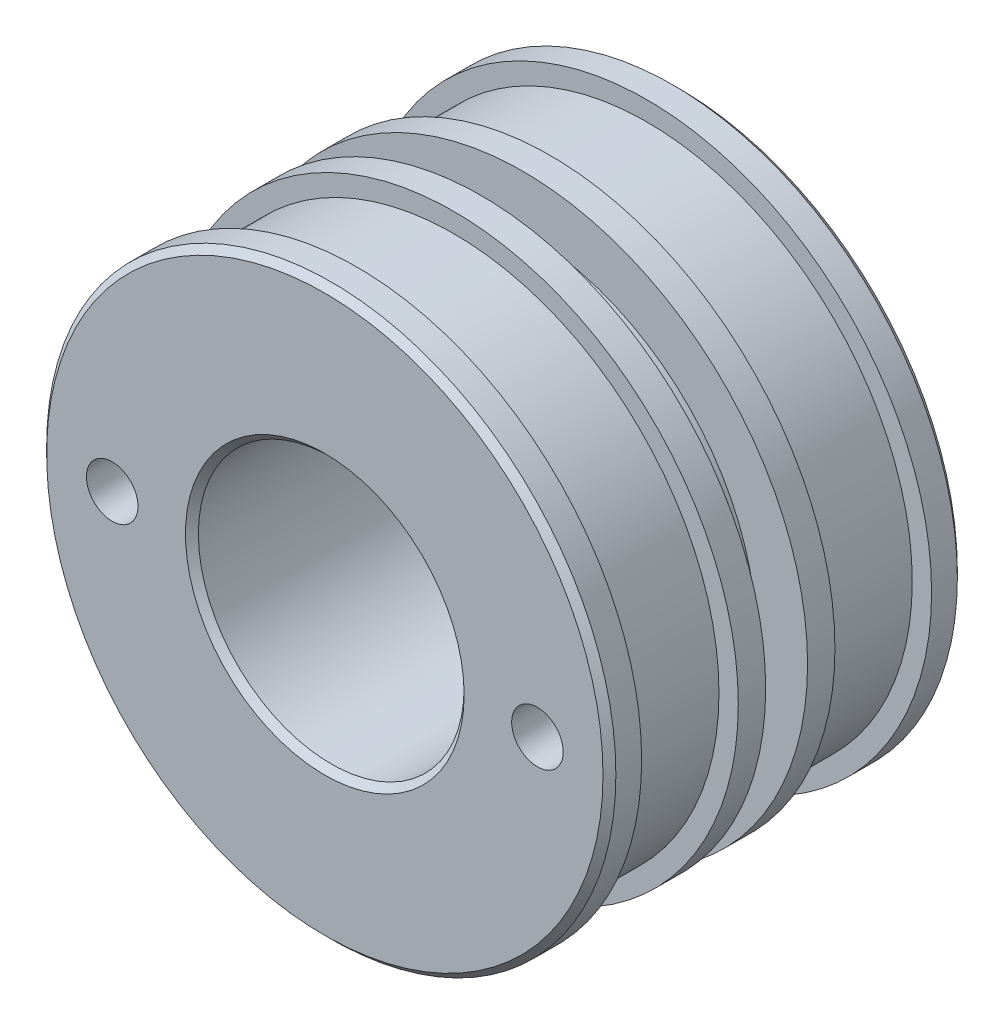
ISO-10303-21;
HEADER;
FILE_DESCRIPTION(('STEP AP214'),'2;1');
FILE_NAME('part.step','',(''),(''),'','','');
FILE_SCHEMA(('AUTOMOTIVE_DESIGN { 1 0 10303 214 1 1 1 1 }'));
ENDSEC;
DATA;
#1=APPLICATION_CONTEXT('core data for automotive mechanical design processes');
#2=APPLICATION_PROTOCOL_DEFINITION('international standard','automotive_design',2000,#1);
#3=PRODUCT_CONTEXT('',#1,'mechanical');
#4=PRODUCT('Part','Part','',(#3));
#5=PRODUCT_RELATED_PRODUCT_CATEGORY('part','',(#4));
#6=PRODUCT_DEFINITION_FORMATION('','',#4);
#7=PRODUCT_DEFINITION_CONTEXT('part definition',#1,'design');
#8=PRODUCT_DEFINITION('design','',#6,#7);
#9=PRODUCT_DEFINITION_SHAPE('','',#8);
#10=(LENGTH_UNIT() NAMED_UNIT(*) SI_UNIT(.MILLI.,.METRE.));
#11=(NAMED_UNIT(*) PLANE_ANGLE_UNIT() SI_UNIT($,.RADIAN.));
#12=(NAMED_UNIT(*) SI_UNIT($,.STERADIAN.) SOLID_ANGLE_UNIT());
#13=UNCERTAINTY_MEASURE_WITH_UNIT(LENGTH_MEASURE(1.E-05),#10,'distance_accuracy_value','');
#14=(GEOMETRIC_REPRESENTATION_CONTEXT(3) GLOBAL_UNCERTAINTY_ASSIGNED_CONTEXT((#13)) GLOBAL_UNIT_ASSIGNED_CONTEXT((#10,
#11,#12)) REPRESENTATION_CONTEXT('',''));
#15=CARTESIAN_POINT('',(0.,0.,0.));
#16=DIRECTION('',(0.,0.,1.));
#17=DIRECTION('',(1.,0.,0.));
#18=AXIS2_PLACEMENT_3D('',#15,#16,#17);
#19=CARTESIAN_POINT('',(0.,0.,-55.));
#20=DIRECTION('',(0.,0.,1.));
#21=DIRECTION('',(1.,0.,0.));
#22=AXIS2_PLACEMENT_3D('',#19,#20,#21);
#23=CYLINDRICAL_SURFACE('',#22,20.625);
#24=CARTESIAN_POINT('',(0.,0.,-1.00000000000002));
#25=DIRECTION('',(0.,0.,1.));
#26=DIRECTION('',(1.,0.,0.));
#27=AXIS2_PLACEMENT_3D('',#24,#25,#26);
#28=CIRCLE('',#27,20.625);
#29=CARTESIAN_POINT('',(20.625,0.,-1.00000000000002));
#30=VERTEX_POINT('',#29);
#31=EDGE_CURVE('E86',#30,#30,#28,.T.);
#32=ORIENTED_EDGE('',*,*,#31,.T.);
#33=EDGE_LOOP('',(#32));
#34=FACE_BOUND('',#33,.T.);
#35=CARTESIAN_POINT('',(0.,0.,-40.));
#36=DIRECTION('',(0.,0.,-1.));
#37=DIRECTION('',(-1.,0.,0.));
#38=AXIS2_PLACEMENT_3D('',#35,#36,#37);
#39=CIRCLE('',#38,20.625);
#40=CARTESIAN_POINT('',(-20.625,0.,-40.));
#41=VERTEX_POINT('',#40);
#42=EDGE_CURVE('E65',#41,#41,#39,.F.);
#43=ORIENTED_EDGE('',*,*,#42,.F.);
#44=EDGE_LOOP('',(#43));
#45=FACE_BOUND('',#44,.T.);
#46=ADVANCED_FACE('F43',(#34,#45),#23,.F.);
#47=CARTESIAN_POINT('',(0.,0.,-55.));
#48=DIRECTION('',(0.,0.,1.));
#49=DIRECTION('',(1.,0.,0.));
#50=AXIS2_PLACEMENT_3D('',#47,#48,#49);
#51=CYLINDRICAL_SURFACE('',#50,44.175);
#52=CARTESIAN_POINT('',(0.,0.,-1.00000000000004));
#53=DIRECTION('',(0.,0.,1.));
#54=DIRECTION('',(1.,0.,0.));
#55=AXIS2_PLACEMENT_3D('',#52,#53,#54);
#56=CIRCLE('',#55,44.175);
#57=CARTESIAN_POINT('',(44.175,0.,-1.00000000000004));
#58=VERTEX_POINT('',#57);
#59=EDGE_CURVE('E74',#58,#58,#56,.F.);
#60=ORIENTED_EDGE('',*,*,#59,.T.);
#61=EDGE_LOOP('',(#60));
#62=FACE_BOUND('',#61,.T.);
#63=CARTESIAN_POINT('',(0.,0.,-5.));
#64=DIRECTION('',(0.,0.,1.));
#65=DIRECTION('',(1.,0.,0.));
#66=AXIS2_PLACEMENT_3D('',#63,#64,#65);
#67=CIRCLE('',#66,44.175);
#68=CARTESIAN_POINT('',(44.175,0.,-5.));
#69=VERTEX_POINT('',#68);
#70=EDGE_CURVE('E111',#69,#69,#67,.T.);
#71=ORIENTED_EDGE('',*,*,#70,.T.);
#72=EDGE_LOOP('',(#71));
#73=FACE_BOUND('',#72,.T.);
#74=ADVANCED_FACE('F196',(#62,#73),#51,.T.);
#75=CARTESIAN_POINT('',(0.,0.,-54.));
#76=DIRECTION('',(0.,0.,1.));
#77=DIRECTION('',(1.,0.,0.));
#78=AXIS2_PLACEMENT_3D('',#75,#76,#77);
#79=CIRCLE('',#78,44.175);
#80=CARTESIAN_POINT('',(44.175,0.,-54.));
#81=VERTEX_POINT('',#80);
#82=EDGE_CURVE('E57',#81,#81,#79,.T.);
#83=ORIENTED_EDGE('',*,*,#82,.T.);
#84=EDGE_LOOP('',(#83));
#85=FACE_BOUND('',#84,.T.);
#86=CARTESIAN_POINT('',(0.,0.,-50.));
#87=DIRECTION('',(0.,0.,1.));
#88=DIRECTION('',(1.,0.,0.));
#89=AXIS2_PLACEMENT_3D('',#86,#87,#88);
#90=CIRCLE('',#89,44.175);
#91=CARTESIAN_POINT('',(44.175,0.,-50.));
#92=VERTEX_POINT('',#91);
#93=EDGE_CURVE('E100',#92,#92,#90,.T.);
#94=ORIENTED_EDGE('',*,*,#93,.F.);
#95=EDGE_LOOP('',(#94));
#96=FACE_BOUND('',#95,.T.);
#97=ADVANCED_FACE('F202',(#85,#96),#51,.T.);
#98=CARTESIAN_POINT('',(0.,0.,-55.));
#99=DIRECTION('',(0.,0.,1.));
#100=DIRECTION('',(1.,0.,0.));
#101=AXIS2_PLACEMENT_3D('',#98,#99,#100);
#102=PLANE('',#101);
#103=CARTESIAN_POINT('',(0.,0.,-55.));
#104=DIRECTION('',(0.,0.,1.));
#105=DIRECTION('',(1.,0.,0.));
#106=AXIS2_PLACEMENT_3D('',#103,#104,#105);
#107=CIRCLE('',#106,25.5);
#108=CARTESIAN_POINT('',(25.5,0.,-55.));
#109=VERTEX_POINT('',#108);
#110=EDGE_CURVE('E10',#109,#109,#107,.T.);
#111=ORIENTED_EDGE('',*,*,#110,.T.);
#112=EDGE_LOOP('',(#111));
#113=FACE_BOUND('',#112,.T.);
#114=CARTESIAN_POINT('',(0.,0.,-55.));
#115=DIRECTION('',(0.,0.,1.));
#116=DIRECTION('',(1.,0.,0.));
#117=AXIS2_PLACEMENT_3D('',#114,#115,#116);
#118=CIRCLE('',#117,43.175);
#119=CARTESIAN_POINT('',(43.175,0.,-55.));
#120=VERTEX_POINT('',#119);
#121=EDGE_CURVE('E62',#120,#120,#118,.F.);
#122=ORIENTED_EDGE('',*,*,#121,.T.);
#123=EDGE_LOOP('',(#122));
#124=FACE_BOUND('',#123,.T.);
#125=ADVANCED_FACE('F170',(#113,#124),#102,.F.);
#126=CARTESIAN_POINT('',(0.,0.,0.));
#127=DIRECTION('',(0.,0.,1.));
#128=DIRECTION('',(1.,0.,0.));
#129=AXIS2_PLACEMENT_3D('',#126,#127,#128);
#130=PLANE('',#129);
#131=CARTESIAN_POINT('',(-33.,0.,0.));
#132=DIRECTION('',(0.,0.,1.));
#133=DIRECTION('',(1.,0.,0.));
#134=AXIS2_PLACEMENT_3D('',#131,#132,#133);
#135=CIRCLE('',#134,4.);
#136=CARTESIAN_POINT('',(-29.,0.,0.));
#137=VERTEX_POINT('',#136);
#138=EDGE_CURVE('E149',#137,#137,#135,.T.);
#139=ORIENTED_EDGE('',*,*,#138,.F.);
#140=EDGE_LOOP('',(#139));
#141=FACE_BOUND('',#140,.T.);
#142=CARTESIAN_POINT('',(33.,0.,0.));
#143=DIRECTION('',(0.,0.,1.));
#144=DIRECTION('',(1.,0.,0.));
#145=AXIS2_PLACEMENT_3D('',#142,#143,#144);
#146=CIRCLE('',#145,4.00000000000001);
#147=CARTESIAN_POINT('',(37.,0.,0.));
#148=VERTEX_POINT('',#147);
#149=EDGE_CURVE('E145',#148,#148,#146,.T.);
#150=ORIENTED_EDGE('',*,*,#149,.F.);
#151=EDGE_LOOP('',(#150));
#152=FACE_BOUND('',#151,.T.);
#153=CARTESIAN_POINT('',(0.,0.,0.));
#154=DIRECTION('',(0.,0.,1.));
#155=DIRECTION('',(1.,0.,0.));
#156=AXIS2_PLACEMENT_3D('',#153,#154,#155);
#157=CIRCLE('',#156,21.625);
#158=CARTESIAN_POINT('',(21.625,0.,0.));
#159=VERTEX_POINT('',#158);
#160=EDGE_CURVE('E78',#159,#159,#157,.F.);
#161=ORIENTED_EDGE('',*,*,#160,.T.);
#162=EDGE_LOOP('',(#161));
#163=FACE_BOUND('',#162,.T.);
#164=CARTESIAN_POINT('',(0.,0.,0.));
#165=DIRECTION('',(0.,0.,1.));
#166=DIRECTION('',(1.,0.,0.));
#167=AXIS2_PLACEMENT_3D('',#164,#165,#166);
#168=CIRCLE('',#167,43.175);
#169=CARTESIAN_POINT('',(43.175,0.,0.));
#170=VERTEX_POINT('',#169);
#171=EDGE_CURVE('E82',#170,#170,#168,.T.);
#172=ORIENTED_EDGE('',*,*,#171,.T.);
#173=EDGE_LOOP('',(#172));
#174=FACE_BOUND('',#173,.T.);
#175=ADVANCED_FACE('F166',(#141,#152,#163,#174),#130,.T.);
#176=CARTESIAN_POINT('',(0.,44.175,-35.));
#177=DIRECTION('',(0.,0.,-1.));
#178=DIRECTION('',(-1.,0.,0.));
#179=AXIS2_PLACEMENT_3D('',#176,#177,#178);
#180=PLANE('',#179);
#181=CARTESIAN_POINT('',(0.,0.,-35.));
#182=DIRECTION('',(0.,0.,1.));
#183=DIRECTION('',(1.,0.,0.));
#184=AXIS2_PLACEMENT_3D('',#181,#182,#183);
#185=CIRCLE('',#184,41.175);
#186=CARTESIAN_POINT('',(41.175,0.,-35.));
#187=VERTEX_POINT('',#186);
#188=EDGE_CURVE('E91',#187,#187,#185,.T.);
#189=ORIENTED_EDGE('',*,*,#188,.T.);
#190=EDGE_LOOP('',(#189));
#191=FACE_BOUND('',#190,.T.);
#192=CARTESIAN_POINT('',(0.,0.,-35.));
#193=DIRECTION('',(0.,0.,1.));
#194=DIRECTION('',(1.,0.,0.));
#195=AXIS2_PLACEMENT_3D('',#192,#193,#194);
#196=CIRCLE('',#195,44.175);
#197=CARTESIAN_POINT('',(44.175,0.,-35.));
#198=VERTEX_POINT('',#197);
#199=EDGE_CURVE('E68',#198,#198,#196,.T.);
#200=ORIENTED_EDGE('',*,*,#199,.F.);
#201=EDGE_LOOP('',(#200));
#202=FACE_BOUND('',#201,.T.);
#203=ADVANCED_FACE('F169',(#191,#202),#180,.T.);
#204=CARTESIAN_POINT('',(0.,0.,0.));
#205=DIRECTION('',(0.,0.,1.));
#206=DIRECTION('',(1.,0.,0.));
#207=AXIS2_PLACEMENT_3D('',#204,#205,#206);
#208=CYLINDRICAL_SURFACE('',#207,41.175);
#209=CARTESIAN_POINT('',(0.,0.,-50.));
#210=DIRECTION('',(0.,0.,1.));
#211=DIRECTION('',(1.,0.,0.));
#212=AXIS2_PLACEMENT_3D('',#209,#210,#211);
#213=CIRCLE('',#212,41.175);
#214=CARTESIAN_POINT('',(41.175,0.,-50.));
#215=VERTEX_POINT('',#214);
#216=EDGE_CURVE('E96',#215,#215,#213,.T.);
#217=ORIENTED_EDGE('',*,*,#216,.T.);
#218=EDGE_LOOP('',(#217));
#219=FACE_BOUND('',#218,.T.);
#220=ORIENTED_EDGE('',*,*,#188,.F.);
#221=EDGE_LOOP('',(#220));
#222=FACE_BOUND('',#221,.T.);
#223=ADVANCED_FACE('F236',(#219,#222),#208,.T.);
#224=CARTESIAN_POINT('',(0.,44.175,-50.));
#225=DIRECTION('',(0.,0.,1.));
#226=DIRECTION('',(1.,0.,0.));
#227=AXIS2_PLACEMENT_3D('',#224,#225,#226);
#228=PLANE('',#227);
#229=ORIENTED_EDGE('',*,*,#93,.T.);
#230=EDGE_LOOP('',(#229));
#231=FACE_BOUND('',#230,.T.);
#232=ORIENTED_EDGE('',*,*,#216,.F.);
#233=EDGE_LOOP('',(#232));
#234=FACE_BOUND('',#233,.T.);
#235=ADVANCED_FACE('F233',(#231,#234),#228,.T.);
#236=ORIENTED_EDGE('',*,*,#199,.T.);
#237=EDGE_LOOP('',(#236));
#238=FACE_BOUND('',#237,.T.);
#239=CARTESIAN_POINT('',(0.,0.,-30.75));
#240=DIRECTION('',(0.,0.,1.));
#241=DIRECTION('',(1.,0.,0.));
#242=AXIS2_PLACEMENT_3D('',#239,#240,#241);
#243=CIRCLE('',#242,44.175);
#244=CARTESIAN_POINT('',(44.175,0.,-30.75));
#245=VERTEX_POINT('',#244);
#246=EDGE_CURVE('E116',#245,#245,#243,.T.);
#247=ORIENTED_EDGE('',*,*,#246,.F.);
#248=EDGE_LOOP('',(#247));
#249=FACE_BOUND('',#248,.T.);
#250=ADVANCED_FACE('F225',(#238,#249),#51,.T.);
#251=CARTESIAN_POINT('',(0.,44.175,-24.25));
#252=DIRECTION('',(0.,0.,-1.));
#253=DIRECTION('',(-1.,0.,0.));
#254=AXIS2_PLACEMENT_3D('',#251,#252,#253);
#255=PLANE('',#254);
#256=CARTESIAN_POINT('',(0.,0.,-24.25));
#257=DIRECTION('',(0.,0.,1.));
#258=DIRECTION('',(1.,0.,0.));
#259=AXIS2_PLACEMENT_3D('',#256,#257,#258);
#260=CIRCLE('',#259,36.175);
#261=CARTESIAN_POINT('',(36.175,0.,-24.25));
#262=VERTEX_POINT('',#261);
#263=EDGE_CURVE('E107',#262,#262,#260,.T.);
#264=ORIENTED_EDGE('',*,*,#263,.T.);
#265=EDGE_LOOP('',(#264));
#266=FACE_BOUND('',#265,.T.);
#267=CARTESIAN_POINT('',(0.,0.,-24.25));
#268=DIRECTION('',(0.,0.,1.));
#269=DIRECTION('',(1.,0.,0.));
#270=AXIS2_PLACEMENT_3D('',#267,#268,#269);
#271=CIRCLE('',#270,44.175);
#272=CARTESIAN_POINT('',(44.175,0.,-24.25));
#273=VERTEX_POINT('',#272);
#274=EDGE_CURVE('E95',#273,#273,#271,.T.);
#275=ORIENTED_EDGE('',*,*,#274,.F.);
#276=EDGE_LOOP('',(#275));
#277=FACE_BOUND('',#276,.T.);
#278=ADVANCED_FACE('F250',(#266,#277),#255,.T.);
#279=CARTESIAN_POINT('',(0.,0.,0.));
#280=DIRECTION('',(0.,0.,1.));
#281=DIRECTION('',(1.,0.,0.));
#282=AXIS2_PLACEMENT_3D('',#279,#280,#281);
#283=CYLINDRICAL_SURFACE('',#282,36.175);
#284=CARTESIAN_POINT('',(0.,0.,-30.75));
#285=DIRECTION('',(0.,0.,1.));
#286=DIRECTION('',(1.,0.,0.));
#287=AXIS2_PLACEMENT_3D('',#284,#285,#286);
#288=CIRCLE('',#287,36.175);
#289=CARTESIAN_POINT('',(36.175,0.,-30.75));
#290=VERTEX_POINT('',#289);
#291=EDGE_CURVE('E112',#290,#290,#288,.T.);
#292=ORIENTED_EDGE('',*,*,#291,.T.);
#293=EDGE_LOOP('',(#292));
#294=FACE_BOUND('',#293,.T.);
#295=ORIENTED_EDGE('',*,*,#263,.F.);
#296=EDGE_LOOP('',(#295));
#297=FACE_BOUND('',#296,.T.);
#298=ADVANCED_FACE('F256',(#294,#297),#283,.T.);
#299=CARTESIAN_POINT('',(0.,44.175,-30.75));
#300=DIRECTION('',(0.,0.,1.));
#301=DIRECTION('',(1.,0.,0.));
#302=AXIS2_PLACEMENT_3D('',#299,#300,#301);
#303=PLANE('',#302);
#304=ORIENTED_EDGE('',*,*,#246,.T.);
#305=EDGE_LOOP('',(#304));
#306=FACE_BOUND('',#305,.T.);
#307=ORIENTED_EDGE('',*,*,#291,.F.);
#308=EDGE_LOOP('',(#307));
#309=FACE_BOUND('',#308,.T.);
#310=ADVANCED_FACE('F253',(#306,#309),#303,.T.);
#311=ORIENTED_EDGE('',*,*,#274,.T.);
#312=EDGE_LOOP('',(#311));
#313=FACE_BOUND('',#312,.T.);
#314=CARTESIAN_POINT('',(0.,0.,-20.));
#315=DIRECTION('',(0.,0.,1.));
#316=DIRECTION('',(1.,0.,0.));
#317=AXIS2_PLACEMENT_3D('',#314,#315,#316);
#318=CIRCLE('',#317,44.175);
#319=CARTESIAN_POINT('',(44.175,0.,-20.));
#320=VERTEX_POINT('',#319);
#321=EDGE_CURVE('E130',#320,#320,#318,.T.);
#322=ORIENTED_EDGE('',*,*,#321,.F.);
#323=EDGE_LOOP('',(#322));
#324=FACE_BOUND('',#323,.T.);
#325=ADVANCED_FACE('F205',(#313,#324),#51,.T.);
#326=CARTESIAN_POINT('',(0.,44.175,-5.));
#327=DIRECTION('',(0.,0.,-1.));
#328=DIRECTION('',(-1.,0.,0.));
#329=AXIS2_PLACEMENT_3D('',#326,#327,#328);
#330=PLANE('',#329);
#331=CARTESIAN_POINT('',(0.,0.,-5.));
#332=DIRECTION('',(0.,0.,1.));
#333=DIRECTION('',(1.,0.,0.));
#334=AXIS2_PLACEMENT_3D('',#331,#332,#333);
#335=CIRCLE('',#334,41.175);
#336=CARTESIAN_POINT('',(41.175,0.,-5.));
#337=VERTEX_POINT('',#336);
#338=EDGE_CURVE('E90',#337,#337,#335,.T.);
#339=ORIENTED_EDGE('',*,*,#338,.T.);
#340=EDGE_LOOP('',(#339));
#341=FACE_BOUND('',#340,.T.);
#342=ORIENTED_EDGE('',*,*,#70,.F.);
#343=EDGE_LOOP('',(#342));
#344=FACE_BOUND('',#343,.T.);
#345=ADVANCED_FACE('F272',(#341,#344),#330,.T.);
#346=CARTESIAN_POINT('',(0.,0.,0.));
#347=DIRECTION('',(0.,0.,1.));
#348=DIRECTION('',(1.,0.,0.));
#349=AXIS2_PLACEMENT_3D('',#346,#347,#348);
#350=CYLINDRICAL_SURFACE('',#349,41.175);
#351=CARTESIAN_POINT('',(0.,0.,-20.));
#352=DIRECTION('',(0.,0.,1.));
#353=DIRECTION('',(1.,0.,0.));
#354=AXIS2_PLACEMENT_3D('',#351,#352,#353);
#355=CIRCLE('',#354,41.175);
#356=CARTESIAN_POINT('',(41.175,0.,-20.));
#357=VERTEX_POINT('',#356);
#358=EDGE_CURVE('E126',#357,#357,#355,.T.);
#359=ORIENTED_EDGE('',*,*,#358,.T.);
#360=EDGE_LOOP('',(#359));
#361=FACE_BOUND('',#360,.T.);
#362=ORIENTED_EDGE('',*,*,#338,.F.);
#363=EDGE_LOOP('',(#362));
#364=FACE_BOUND('',#363,.T.);
#365=ADVANCED_FACE('F277',(#361,#364),#350,.T.);
#366=CARTESIAN_POINT('',(0.,44.175,-20.));
#367=DIRECTION('',(0.,0.,1.));
#368=DIRECTION('',(1.,0.,0.));
#369=AXIS2_PLACEMENT_3D('',#366,#367,#368);
#370=PLANE('',#369);
#371=ORIENTED_EDGE('',*,*,#321,.T.);
#372=EDGE_LOOP('',(#371));
#373=FACE_BOUND('',#372,.T.);
#374=ORIENTED_EDGE('',*,*,#358,.F.);
#375=EDGE_LOOP('',(#374));
#376=FACE_BOUND('',#375,.T.);
#377=ADVANCED_FACE('F190',(#373,#376),#370,.T.);
#378=CARTESIAN_POINT('',(0.,0.,-1.00000000000002));
#379=DIRECTION('',(0.,0.,1.));
#380=DIRECTION('',(1.,0.,0.));
#381=AXIS2_PLACEMENT_3D('',#378,#379,#380);
#382=CONICAL_SURFACE('',#381,20.625,0.785398163397453);
#383=ORIENTED_EDGE('',*,*,#160,.F.);
#384=EDGE_LOOP('',(#383));
#385=FACE_BOUND('',#384,.T.);
#386=ORIENTED_EDGE('',*,*,#31,.F.);
#387=EDGE_LOOP('',(#386));
#388=FACE_BOUND('',#387,.T.);
#389=ADVANCED_FACE('F181',(#385,#388),#382,.F.);
#390=CARTESIAN_POINT('',(0.,0.,0.));
#391=DIRECTION('',(0.,0.,-1.));
#392=DIRECTION('',(-1.,0.,0.));
#393=AXIS2_PLACEMENT_3D('',#390,#391,#392);
#394=CONICAL_SURFACE('',#393,43.175,0.785398163397434);
#395=ORIENTED_EDGE('',*,*,#59,.F.);
#396=EDGE_LOOP('',(#395));
#397=FACE_BOUND('',#396,.T.);
#398=ORIENTED_EDGE('',*,*,#171,.F.);
#399=EDGE_LOOP('',(#398));
#400=FACE_BOUND('',#399,.T.);
#401=ADVANCED_FACE('F178',(#397,#400),#394,.T.);
#402=CARTESIAN_POINT('',(0.,0.,-54.));
#403=DIRECTION('',(0.,0.,1.));
#404=DIRECTION('',(1.,0.,0.));
#405=AXIS2_PLACEMENT_3D('',#402,#403,#404);
#406=CONICAL_SURFACE('',#405,44.175,0.785398163397459);
#407=ORIENTED_EDGE('',*,*,#121,.F.);
#408=EDGE_LOOP('',(#407));
#409=FACE_BOUND('',#408,.T.);
#410=ORIENTED_EDGE('',*,*,#82,.F.);
#411=EDGE_LOOP('',(#410));
#412=FACE_BOUND('',#411,.T.);
#413=ADVANCED_FACE('F180',(#409,#412),#406,.T.);
#414=CARTESIAN_POINT('',(0.,0.,-40.));
#415=DIRECTION('',(0.,0.,-1.));
#416=DIRECTION('',(-1.,0.,0.));
#417=AXIS2_PLACEMENT_3D('',#414,#415,#416);
#418=PLANE('',#417);
#419=CARTESIAN_POINT('',(0.,0.,-40.));
#420=DIRECTION('',(0.,0.,-1.));
#421=DIRECTION('',(-1.,0.,0.));
#422=AXIS2_PLACEMENT_3D('',#419,#420,#421);
#423=CIRCLE('',#422,24.5);
#424=CARTESIAN_POINT('',(-24.5,0.,-40.));
#425=VERTEX_POINT('',#424);
#426=EDGE_CURVE('E69',#425,#425,#423,.T.);
#427=ORIENTED_EDGE('',*,*,#426,.T.);
#428=EDGE_LOOP('',(#427));
#429=FACE_BOUND('',#428,.T.);
#430=ORIENTED_EDGE('',*,*,#42,.T.);
#431=EDGE_LOOP('',(#430));
#432=FACE_BOUND('',#431,.T.);
#433=ADVANCED_FACE('F188',(#429,#432),#418,.T.);
#434=CARTESIAN_POINT('',(0.,0.,-40.));
#435=DIRECTION('',(0.,0.,-1.));
#436=DIRECTION('',(-1.,0.,0.));
#437=AXIS2_PLACEMENT_3D('',#434,#435,#436);
#438=CYLINDRICAL_SURFACE('',#437,24.5);
#439=CARTESIAN_POINT('',(0.,0.,-54.));
#440=DIRECTION('',(0.,0.,1.));
#441=DIRECTION('',(1.,0.,0.));
#442=AXIS2_PLACEMENT_3D('',#439,#440,#441);
#443=CIRCLE('',#442,24.5);
#444=CARTESIAN_POINT('',(24.5,0.,-54.));
#445=VERTEX_POINT('',#444);
#446=EDGE_CURVE('E52',#445,#445,#443,.F.);
#447=ORIENTED_EDGE('',*,*,#446,.T.);
#448=EDGE_LOOP('',(#447));
#449=FACE_BOUND('',#448,.T.);
#450=ORIENTED_EDGE('',*,*,#426,.F.);
#451=EDGE_LOOP('',(#450));
#452=FACE_BOUND('',#451,.T.);
#453=ADVANCED_FACE('F294',(#449,#452),#438,.F.);
#454=CARTESIAN_POINT('',(0.,0.,-54.));
#455=DIRECTION('',(0.,0.,-1.));
#456=DIRECTION('',(-1.,0.,0.));
#457=AXIS2_PLACEMENT_3D('',#454,#455,#456);
#458=CONICAL_SURFACE('',#457,24.5,0.785398163397452);
#459=ORIENTED_EDGE('',*,*,#110,.F.);
#460=EDGE_LOOP('',(#459));
#461=FACE_BOUND('',#460,.T.);
#462=ORIENTED_EDGE('',*,*,#446,.F.);
#463=EDGE_LOOP('',(#462));
#464=FACE_BOUND('',#463,.T.);
#465=ADVANCED_FACE('F46',(#461,#464),#458,.F.);
#466=CARTESIAN_POINT('',(33.,0.,-9.));
#467=DIRECTION('',(0.,0.,1.));
#468=DIRECTION('',(1.,0.,0.));
#469=AXIS2_PLACEMENT_3D('',#466,#467,#468);
#470=CYLINDRICAL_SURFACE('',#469,4.00000000000001);
#471=CARTESIAN_POINT('',(33.,0.,-9.));
#472=DIRECTION('',(0.,0.,1.));
#473=DIRECTION('',(1.,0.,0.));
#474=AXIS2_PLACEMENT_3D('',#471,#472,#473);
#475=CIRCLE('',#474,4.00000000000001);
#476=CARTESIAN_POINT('',(37.,0.,-9.));
#477=VERTEX_POINT('',#476);
#478=EDGE_CURVE('E141',#477,#477,#475,.T.);
#479=ORIENTED_EDGE('',*,*,#478,.F.);
#480=EDGE_LOOP('',(#479));
#481=FACE_BOUND('',#480,.T.);
#482=ORIENTED_EDGE('',*,*,#149,.T.);
#483=EDGE_LOOP('',(#482));
#484=FACE_BOUND('',#483,.T.);
#485=ADVANCED_FACE('F302',(#481,#484),#470,.F.);
#486=CARTESIAN_POINT('',(33.,0.,-9.));
#487=DIRECTION('',(0.,0.,1.));
#488=DIRECTION('',(1.,0.,0.));
#489=AXIS2_PLACEMENT_3D('',#486,#487,#488);
#490=PLANE('',#489);
#491=ORIENTED_EDGE('',*,*,#478,.T.);
#492=EDGE_LOOP('',(#491));
#493=FACE_BOUND('',#492,.T.);
#494=ADVANCED_FACE('F162',(#493),#490,.T.);
#495=CARTESIAN_POINT('',(-33.,0.,-9.));
#496=DIRECTION('',(0.,0.,1.));
#497=DIRECTION('',(1.,0.,0.));
#498=AXIS2_PLACEMENT_3D('',#495,#496,#497);
#499=CYLINDRICAL_SURFACE('',#498,4.);
#500=CARTESIAN_POINT('',(-33.,0.,-9.));
#501=DIRECTION('',(0.,0.,1.));
#502=DIRECTION('',(1.,0.,0.));
#503=AXIS2_PLACEMENT_3D('',#500,#501,#502);
#504=CIRCLE('',#503,4.);
#505=CARTESIAN_POINT('',(-29.,0.,-9.));
#506=VERTEX_POINT('',#505);
#507=EDGE_CURVE('E140',#506,#506,#504,.T.);
#508=ORIENTED_EDGE('',*,*,#507,.F.);
#509=EDGE_LOOP('',(#508));
#510=FACE_BOUND('',#509,.T.);
#511=ORIENTED_EDGE('',*,*,#138,.T.);
#512=EDGE_LOOP('',(#511));
#513=FACE_BOUND('',#512,.T.);
#514=ADVANCED_FACE('F159',(#510,#513),#499,.F.);
#515=CARTESIAN_POINT('',(-33.,0.,-9.));
#516=DIRECTION('',(0.,0.,1.));
#517=DIRECTION('',(1.,0.,0.));
#518=AXIS2_PLACEMENT_3D('',#515,#516,#517);
#519=PLANE('',#518);
#520=ORIENTED_EDGE('',*,*,#507,.T.);
#521=EDGE_LOOP('',(#520));
#522=FACE_BOUND('',#521,.T.);
#523=ADVANCED_FACE('F157',(#522),#519,.T.);
#524=CLOSED_SHELL('',(#46,#74,#97,#125,#175,#203,#223,#235,#250,#278,#298,#310,#325,#345,#365,
#377,#389,#401,#413,#433,#453,#465,#485,#494,#514,#523));
#525=MANIFOLD_SOLID_BREP('B2',#524);
#526=ADVANCED_BREP_SHAPE_REPRESENTATION('',(#18,#525),#14);
#527=SHAPE_DEFINITION_REPRESENTATION(#9,#526);
ENDSEC;
END-ISO-10303-21;
